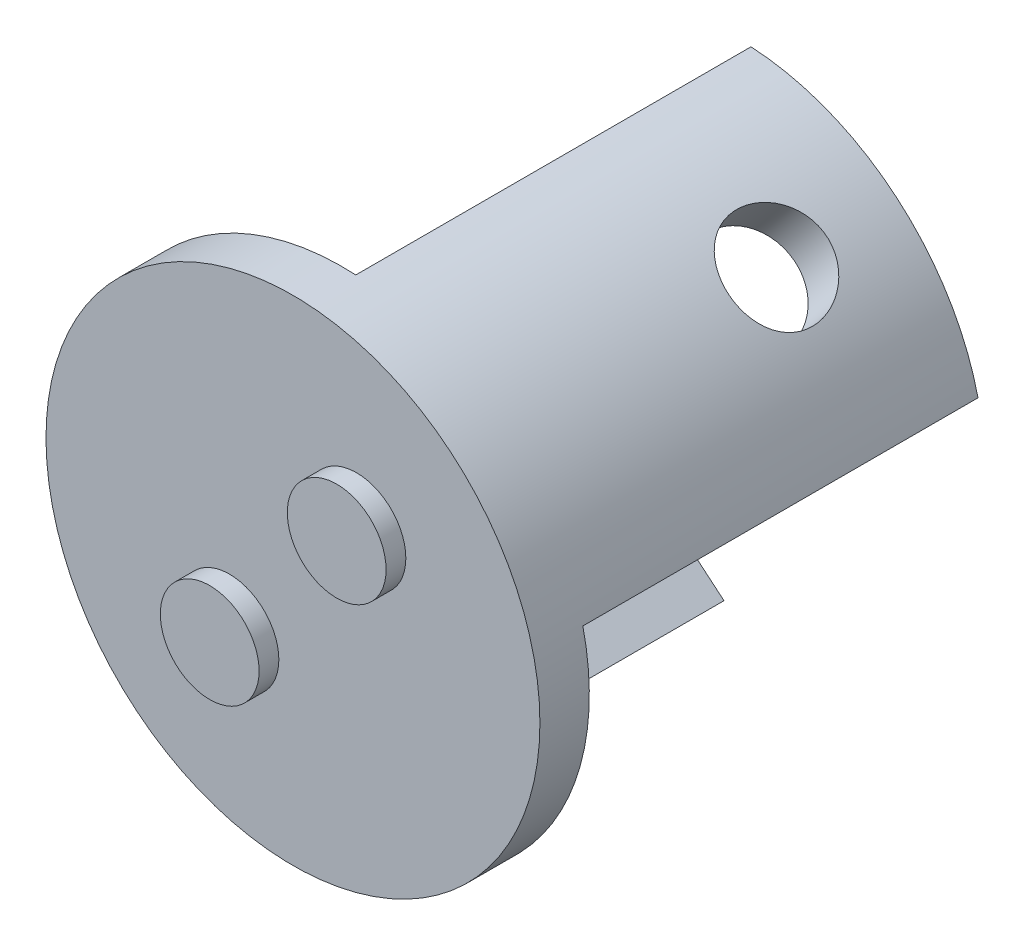
ISO-10303-21;
HEADER;
FILE_DESCRIPTION(('STEP AP214'),'2;1');
FILE_NAME('part.step','',(''),(''),'','','');
FILE_SCHEMA(('AUTOMOTIVE_DESIGN { 1 0 10303 214 1 1 1 1 }'));
ENDSEC;
DATA;
#1=APPLICATION_CONTEXT('core data for automotive mechanical design processes');
#2=APPLICATION_PROTOCOL_DEFINITION('international standard','automotive_design',2000,#1);
#3=PRODUCT_CONTEXT('',#1,'mechanical');
#4=PRODUCT('Part','Part','',(#3));
#5=PRODUCT_RELATED_PRODUCT_CATEGORY('part','',(#4));
#6=PRODUCT_DEFINITION_FORMATION('','',#4);
#7=PRODUCT_DEFINITION_CONTEXT('part definition',#1,'design');
#8=PRODUCT_DEFINITION('design','',#6,#7);
#9=PRODUCT_DEFINITION_SHAPE('','',#8);
#10=(LENGTH_UNIT() NAMED_UNIT(*) SI_UNIT(.MILLI.,.METRE.));
#11=(NAMED_UNIT(*) PLANE_ANGLE_UNIT() SI_UNIT($,.RADIAN.));
#12=(NAMED_UNIT(*) SI_UNIT($,.STERADIAN.) SOLID_ANGLE_UNIT());
#13=UNCERTAINTY_MEASURE_WITH_UNIT(LENGTH_MEASURE(1.E-05),#10,'distance_accuracy_value','');
#14=(GEOMETRIC_REPRESENTATION_CONTEXT(3) GLOBAL_UNCERTAINTY_ASSIGNED_CONTEXT((#13)) GLOBAL_UNIT_ASSIGNED_CONTEXT((#10,
#11,#12)) REPRESENTATION_CONTEXT('',''));
#15=CARTESIAN_POINT('',(0.,0.,0.));
#16=DIRECTION('',(0.,0.,1.));
#17=DIRECTION('',(1.,0.,0.));
#18=AXIS2_PLACEMENT_3D('',#15,#16,#17);
#19=CARTESIAN_POINT('',(0.,0.,0.));
#20=DIRECTION('',(0.,0.,1.));
#21=DIRECTION('',(1.,0.,0.));
#22=AXIS2_PLACEMENT_3D('',#19,#20,#21);
#23=PLANE('',#22);
#24=DIRECTION('',(0.766044443118976,-0.642787609686541,0.));
#25=VECTOR('',#24,1.);
#26=CARTESIAN_POINT('',(-12.8557521937308,-15.3208888623795,0.));
#27=LINE('',#26,#25);
#28=CARTESIAN_POINT('',(-24.3464188405155,-5.67907471708142,0.));
#29=VERTEX_POINT('',#28);
#30=CARTESIAN_POINT('',(-1.36508554694619,-24.9627030076776,0.));
#31=VERTEX_POINT('',#30);
#32=EDGE_CURVE('E51',#29,#31,#27,.T.);
#33=ORIENTED_EDGE('',*,*,#32,.F.);
#34=CARTESIAN_POINT('',(0.,0.,0.));
#35=DIRECTION('',(0.,0.,1.));
#36=DIRECTION('',(1.,0.,0.));
#37=AXIS2_PLACEMENT_3D('',#34,#35,#36);
#38=CIRCLE('',#37,25.);
#39=CARTESIAN_POINT('',(1.36508554694617,24.9627030076776,0.));
#40=VERTEX_POINT('',#39);
#41=EDGE_CURVE('E91',#40,#29,#38,.T.);
#42=ORIENTED_EDGE('',*,*,#41,.F.);
#43=DIRECTION('',(0.766044443118977,-0.642787609686541,0.));
#44=VECTOR('',#43,1.);
#45=CARTESIAN_POINT('',(12.8557521937308,15.3208888623795,0.));
#46=LINE('',#45,#44);
#47=CARTESIAN_POINT('',(24.3464188405155,5.67907471708142,0.));
#48=VERTEX_POINT('',#47);
#49=EDGE_CURVE('E92',#40,#48,#46,.T.);
#50=ORIENTED_EDGE('',*,*,#49,.T.);
#51=EDGE_CURVE('E58',#31,#48,#38,.T.);
#52=ORIENTED_EDGE('',*,*,#51,.F.);
#53=EDGE_LOOP('',(#33,#42,#50,#52));
#54=FACE_BOUND('',#53,.T.);
#55=ADVANCED_FACE('F34',(#54),#23,.F.);
#56=CARTESIAN_POINT('',(0.,0.,5.));
#57=DIRECTION('',(0.,0.,-1.));
#58=DIRECTION('',(-1.,0.,0.));
#59=AXIS2_PLACEMENT_3D('',#56,#57,#58);
#60=CYLINDRICAL_SURFACE('',#59,25.);
#61=CARTESIAN_POINT('',(19.5752387827479,15.5502420109271,-28.));
#62=CARTESIAN_POINT('',(19.5752399388023,15.5502390648004,-27.8610437715678));
#63=CARTESIAN_POINT('',(19.5715616552449,15.5548738945243,-27.722122240573));
#64=CARTESIAN_POINT('',(19.5568632156549,15.573350711597,-27.4452390892176));
#65=CARTESIAN_POINT('',(19.5458416724991,15.5871944384825,-27.307277655193));
#66=CARTESIAN_POINT('',(19.5164860999277,15.6239341696758,-27.0332858709187));
#67=CARTESIAN_POINT('',(19.4981483310895,15.6468348030395,-26.8972565450725));
#68=CARTESIAN_POINT('',(19.4542177659323,15.7014215351682,-26.6281110791934));
#69=CARTESIAN_POINT('',(19.42862229865,15.7331108682382,-26.4949960311311));
#70=CARTESIAN_POINT('',(19.3703089722856,15.8048493106287,-26.2328438594748));
#71=CARTESIAN_POINT('',(19.3376009952044,15.8448868179931,-26.1038013596023));
#72=CARTESIAN_POINT('',(19.2651413274371,15.9329086557767,-25.8504369587209));
#73=CARTESIAN_POINT('',(19.2253870382121,15.9808959174781,-25.7261168198334));
#74=CARTESIAN_POINT('',(19.138997951603,16.0842559512901,-25.4831366609698));
#75=CARTESIAN_POINT('',(19.0923662123409,16.1396254397801,-25.3644741561491));
#76=CARTESIAN_POINT('',(18.9923503983771,16.2572009585222,-25.1334921966877));
#77=CARTESIAN_POINT('',(18.938963801909,16.3194095408454,-25.0211751337375));
#78=CARTESIAN_POINT('',(18.8249388990272,16.4508155707056,-24.8023273728514));
#79=CARTESIAN_POINT('',(18.7642193379892,16.5200896942465,-24.6958850347564));
#80=CARTESIAN_POINT('',(18.6362660344895,16.6642996161466,-24.4909823888348));
#81=CARTESIAN_POINT('',(18.5690298860477,16.7392375033504,-24.3925250539721));
#82=CARTESIAN_POINT('',(18.4283438678951,16.8939950999759,-24.2043303455566));
#83=CARTESIAN_POINT('',(18.3548958409293,16.9738133597088,-24.114590402856));
#84=CARTESIAN_POINT('',(18.2020488088756,17.1376187104265,-23.9443844675538));
#85=CARTESIAN_POINT('',(18.1226476207836,17.2216073268164,-23.8639219046559));
#86=CARTESIAN_POINT('',(17.957574134156,17.3936725184606,-23.7122400706679));
#87=CARTESIAN_POINT('',(17.8718549037146,17.4817774288316,-23.6411038142726));
#88=CARTESIAN_POINT('',(17.6951710684105,17.6605996043244,-23.5093843802369));
#89=CARTESIAN_POINT('',(17.6042045129115,17.7513178345639,-23.4488051611513));
#90=CARTESIAN_POINT('',(17.3242105560941,18.0260844841214,-23.2837064735327));
#91=CARTESIAN_POINT('',(17.1278904293554,18.2129533419344,-23.1956431521848));
#92=CARTESIAN_POINT('',(16.7236881535392,18.5847454709976,-23.0674427049637));
#93=CARTESIAN_POINT('',(16.5159924250397,18.7696619361236,-23.0266894005891));
#94=CARTESIAN_POINT('',(16.0922117465078,19.1342299580353,-22.9922509518139));
#95=CARTESIAN_POINT('',(15.876127606868,19.3138820204794,-22.9985612718641));
#96=CARTESIAN_POINT('',(15.4451005611953,19.6602206612749,-23.0576294026319));
#97=CARTESIAN_POINT('',(15.2301852250241,19.8270554449764,-23.1097244842391));
#98=CARTESIAN_POINT('',(14.8049963337883,20.1465341954522,-23.2578255639107));
#99=CARTESIAN_POINT('',(14.5947229647983,20.299177594145,-23.3538333188906));
#100=CARTESIAN_POINT('',(14.1841859837537,20.5881603367852,-23.5876500921249));
#101=CARTESIAN_POINT('',(13.9839938034357,20.7243908714696,-23.7257187264038));
#102=CARTESIAN_POINT('',(13.6016201687298,20.9773345342774,-24.039545415307));
#103=CARTESIAN_POINT('',(13.4194407902992,21.0940454138496,-24.2153078067188));
#104=CARTESIAN_POINT('',(13.076346869086,21.308469265876,-24.603168102539));
#105=CARTESIAN_POINT('',(12.9158583139285,21.4058156520225,-24.8158459315038));
#106=CARTESIAN_POINT('',(12.6259471423197,21.5780903370969,-25.269582214398));
#107=CARTESIAN_POINT('',(12.4965251134485,21.6530182120163,-25.5106412049894));
#108=CARTESIAN_POINT('',(12.2736700447617,21.7801192782732,-26.0151041585344));
#109=CARTESIAN_POINT('',(12.1803146179855,21.8322434289843,-26.2785548380507));
#110=CARTESIAN_POINT('',(12.0340232052588,21.913223124176,-26.8198566187675));
#111=CARTESIAN_POINT('',(11.9810819514233,21.9420817012927,-27.0977058381111));
#112=CARTESIAN_POINT('',(11.9185521594503,21.9761091680608,-27.654824289987));
#113=CARTESIAN_POINT('',(11.9082373036806,21.9816749679074,-27.9339878716477));
#114=CARTESIAN_POINT('',(11.9294284223582,21.9701815655108,-28.4902411159245));
#115=CARTESIAN_POINT('',(11.9609320253527,21.9531236462197,-28.7673308952462));
#116=CARTESIAN_POINT('',(12.063842662026,21.8967361327185,-29.308843201799));
#117=CARTESIAN_POINT('',(12.1348641690568,21.8576216677851,-29.5733617164651));
#118=CARTESIAN_POINT('',(12.3135426773012,21.7574606175965,-30.0853163938573));
#119=CARTESIAN_POINT('',(12.4212026964356,21.6964122256166,-30.3327511473708));
#120=CARTESIAN_POINT('',(12.6705286990509,21.5517671240796,-30.8070655546213));
#121=CARTESIAN_POINT('',(12.8126196355626,21.4678868848336,-31.0336352497929));
#122=CARTESIAN_POINT('',(13.124690479875,21.2785275143757,-31.4565415417139));
#123=CARTESIAN_POINT('',(13.2946732579035,21.1730461600099,-31.6528750229515));
#124=CARTESIAN_POINT('',(13.6592882622623,20.9397068569448,-32.0128128652711));
#125=CARTESIAN_POINT('',(13.8542588258498,20.8115302616111,-32.1758685338953));
#126=CARTESIAN_POINT('',(14.2599374296815,20.5356820862245,-32.4607291468636));
#127=CARTESIAN_POINT('',(14.4706448085713,20.3880113252322,-32.5825358235458));
#128=CARTESIAN_POINT('',(14.899388774118,20.0768021503246,-32.7806453263062));
#129=CARTESIAN_POINT('',(15.1173761583466,19.9133600252156,-32.8572061926372));
#130=CARTESIAN_POINT('',(15.5548619161382,19.5735214871039,-32.9634526372471));
#131=CARTESIAN_POINT('',(15.7743601045148,19.3971266370252,-32.9931438612975));
#132=CARTESIAN_POINT('',(16.0974477734558,19.1282927056451,-33.0018003890947));
#133=CARTESIAN_POINT('',(16.2032564829247,19.0387410986983,-32.9988756420099));
#134=CARTESIAN_POINT('',(16.4128197901022,18.8583771110472,-32.9815385408312));
#135=CARTESIAN_POINT('',(16.5165751515464,18.767565221326,-32.9671305434389));
#136=CARTESIAN_POINT('',(16.7213640776187,18.5853382242976,-32.9269286368397));
#137=CARTESIAN_POINT('',(16.8223966866899,18.4939229188792,-32.9011307841561));
#138=CARTESIAN_POINT('',(17.0210309018278,18.3112724897373,-32.8383651655105));
#139=CARTESIAN_POINT('',(17.1186337205368,18.2200373133175,-32.8014013926633));
#140=CARTESIAN_POINT('',(17.3096726367366,18.0386405641335,-32.716666157964));
#141=CARTESIAN_POINT('',(17.4031164444738,17.9484772530634,-32.6689157852204));
#142=CARTESIAN_POINT('',(17.5854881404117,17.7698310663931,-32.562942077317));
#143=CARTESIAN_POINT('',(17.6744176148304,17.6813476074747,-32.5047224538994));
#144=CARTESIAN_POINT('',(17.8473757274636,17.5067497803388,-32.3781933829961));
#145=CARTESIAN_POINT('',(17.9314023309262,17.4206364034576,-32.3098797873512));
#146=CARTESIAN_POINT('',(18.0940892205724,17.2515997296971,-32.1636856073457));
#147=CARTESIAN_POINT('',(18.1727513377297,17.1686753486264,-32.0858083128838));
#148=CARTESIAN_POINT('',(18.3256504895279,17.005388902902,-31.9196372325023));
#149=CARTESIAN_POINT('',(18.399793066899,16.9250917134978,-31.831192745672));
#150=CARTESIAN_POINT('',(18.5418761570465,16.769315462601,-31.6455885973766));
#151=CARTESIAN_POINT('',(18.6098188393822,16.6938347184683,-31.5484320083593));
#152=CARTESIAN_POINT('',(18.7393052222968,16.5483513082206,-31.345972526609));
#153=CARTESIAN_POINT('',(18.8008450713632,16.4783519455255,-31.2406647963557));
#154=CARTESIAN_POINT('',(18.9172291528241,16.3446106998393,-31.0227010381552));
#155=CARTESIAN_POINT('',(18.9720758357533,16.2808665283516,-30.9100477229278));
#156=CARTESIAN_POINT('',(19.0754790244173,16.1595953982595,-30.6768148430827));
#157=CARTESIAN_POINT('',(19.1239583880762,16.1021458774797,-30.5561607708029));
#158=CARTESIAN_POINT('',(19.2137066704173,15.9949480386978,-30.3089555311573));
#159=CARTESIAN_POINT('',(19.2549782371345,15.9451968931984,-30.1824065512268));
#160=CARTESIAN_POINT('',(19.3301633635701,15.8539673670231,-29.9243288844637));
#161=CARTESIAN_POINT('',(19.3640814125222,15.8124839402607,-29.792803293728));
#162=CARTESIAN_POINT('',(19.4244613870496,15.7382521445056,-29.5256860019017));
#163=CARTESIAN_POINT('',(19.4509247552149,15.7055020855439,-29.3900950931365));
#164=CARTESIAN_POINT('',(19.5073909673155,15.6353655981149,-29.0487823116088));
#165=CARTESIAN_POINT('',(19.5328206461949,15.6035138122674,-28.841122048542));
#166=CARTESIAN_POINT('',(19.5667433838373,15.5609546210052,-28.4222810828269));
#167=CARTESIAN_POINT('',(19.575237026485,15.5502464866447,-28.2111005017978));
#168=CARTESIAN_POINT('',(19.5752387827479,15.5502420109271,-28.));
#169=B_SPLINE_CURVE_WITH_KNOTS('',3,(#61,#62,#63,#64,#65,#66,#67,#68,#69,#70,#71,#72,#73,#74,
#75,#76,#77,#78,#79,#80,#81,#82,#83,#84,#85,#86,#87,#88,#89,#90,#91,#92,#93,#94,#95,#96,#97,#98,
#99,#100,#101,#102,#103,#104,#105,#106,#107,#108,#109,#110,#111,#112,#113,#114,#115,#116,#117,
#118,#119,#120,#121,#122,#123,#124,#125,#126,#127,#128,#129,#130,#131,#132,#133,#134,#135,#136,
#137,#138,#139,#140,#141,#142,#143,#144,#145,#146,#147,#148,#149,#150,#151,#152,#153,#154,#155,
#156,#157,#158,#159,#160,#161,#162,#163,#164,#165,#166,#167,#168),.UNSPECIFIED.,.T.,.F.,(4,2,2,
2,2,2,2,2,2,2,2,2,2,2,2,2,2,2,2,2,2,2,2,2,2,2,2,2,2,2,2,2,2,2,2,2,2,2,2,2,2,2,2,2,2,2,2,2,2,2,2,
2,2,4),(0.,0.416683123532559,0.833444979779735,1.25042012213458,1.66754891843381,
2.08410182437339,2.50080866752238,2.91733077366025,3.33400883985332,3.75582155231457,
4.17779059926177,4.59963490581337,5.02163466502476,5.44716701587087,5.87285858614629,
6.72323197660176,7.56240100842779,8.40148917008619,9.22862804595065,10.0558000179613,
10.8881847753889,11.7206653527771,12.5676559023979,13.4146624704098,14.2634817229126,
15.112190315075,15.9463764545252,16.780515290738,17.6066556534829,18.4328640820369,
19.269841553043,20.1069052078274,20.9568186509895,21.8066963958222,22.6516792432494,
23.4965602988983,23.9121012971265,24.3274847156826,24.7430120641575,25.158390988859,
25.5729647204247,25.9873917587991,26.4019895837877,26.8164451851411,27.2377409358741,
27.6588886906077,28.0802883323103,28.5015332232677,28.9274855291216,29.3532810158644,
29.7788158230356,30.2042682263315,30.8373096537297,31.4703292560956),.UNSPECIFIED.);
#170=CARTESIAN_POINT('',(19.5752387827479,15.5502420109271,-28.));
#171=VERTEX_POINT('',#170);
#172=EDGE_CURVE('E135',#171,#171,#169,.T.);
#173=ORIENTED_EDGE('',*,*,#172,.T.);
#174=EDGE_LOOP('',(#173));
#175=FACE_BOUND('',#174,.T.);
#176=CARTESIAN_POINT('',(-11.9147943515581,-21.9781181077926,-28.));
#177=CARTESIAN_POINT('',(-11.9147912494429,-21.9781187346944,-28.1389562284322));
#178=CARTESIAN_POINT('',(-11.9199943929256,-21.9753011622646,-28.277877759427));
#179=CARTESIAN_POINT('',(-11.9407428628791,-21.964034490613,-28.5547609107824));
#180=CARTESIAN_POINT('',(-11.9562901433306,-21.9555843274088,-28.692722344807));
#181=CARTESIAN_POINT('',(-11.9975692571347,-21.933054519316,-28.9667141290813));
#182=CARTESIAN_POINT('',(-12.0233062985615,-21.9189719956422,-29.1027434549275));
#183=CARTESIAN_POINT('',(-12.0846921981569,-21.8851877210401,-29.3718889208066));
#184=CARTESIAN_POINT('',(-12.120344705302,-21.8654839013576,-29.5050039688689));
#185=CARTESIAN_POINT('',(-12.2011192824141,-21.8205137352398,-29.7671561405252));
#186=CARTESIAN_POINT('',(-12.2462282106932,-21.7952551060171,-29.8961986403977));
#187=CARTESIAN_POINT('',(-12.345495288239,-21.7391810951452,-30.1495630412791));
#188=CARTESIAN_POINT('',(-12.3996567754867,-21.7083636634466,-30.2738831801666));
#189=CARTESIAN_POINT('',(-12.5164478455964,-21.6412353026934,-30.5168633390302));
#190=CARTESIAN_POINT('',(-12.5790736636859,-21.6049268151063,-30.6355258438509));
#191=CARTESIAN_POINT('',(-12.7122305099402,-21.5268472406587,-30.8665078033123));
#192=CARTESIAN_POINT('',(-12.7827644893046,-21.4850741135056,-30.9788248662625));
#193=CARTESIAN_POINT('',(-12.9319743828975,-21.3955999227309,-31.1976726271486));
#194=CARTESIAN_POINT('',(-13.0107399179667,-21.3478321535734,-31.3041149652436));
#195=CARTESIAN_POINT('',(-13.1749778250944,-21.2468645384029,-31.5090176111652));
#196=CARTESIAN_POINT('',(-13.2604526720573,-21.1936626856859,-31.6074749460279));
#197=CARTESIAN_POINT('',(-13.437289023727,-21.0819873789029,-31.7956696544435));
#198=CARTESIAN_POINT('',(-13.5286487807798,-21.0235154878507,-31.885409597144));
#199=CARTESIAN_POINT('',(-13.7165071687294,-20.9014350463035,-32.0556155324462));
#200=CARTESIAN_POINT('',(-13.8130076809317,-20.837824610853,-32.1360780953441));
#201=CARTESIAN_POINT('',(-14.0111235258205,-20.7051377683743,-32.2877599293321));
#202=CARTESIAN_POINT('',(-14.1127749127894,-20.6360200627828,-32.3588961857274));
#203=CARTESIAN_POINT('',(-14.319561203649,-20.4930725968442,-32.4906156197631));
#204=CARTESIAN_POINT('',(-14.4246973967194,-20.4192410830862,-32.5511948388487));
#205=CARTESIAN_POINT('',(-14.743910163832,-20.1912135915951,-32.7162935264673));
#206=CARTESIAN_POINT('',(-14.9620306960503,-20.0303254453325,-32.8043568478153));
#207=CARTESIAN_POINT('',(-15.3983634558649,-19.6968249360062,-32.9325572950363));
#208=CARTESIAN_POINT('',(-15.6165366091437,-19.5243949795022,-32.9733105994109));
#209=CARTESIAN_POINT('',(-16.0491547661802,-19.1703590543477,-33.0077490481861));
#210=CARTESIAN_POINT('',(-16.263600127191,-18.988753971585,-33.0014387281359));
#211=CARTESIAN_POINT('',(-16.6795241668204,-18.6244162690784,-32.9423705973681));
#212=CARTESIAN_POINT('',(-16.8811440117605,-18.441736535937,-32.8902755157609));
#213=CARTESIAN_POINT('',(-17.2696024382791,-18.0784841221767,-32.7421744360893));
#214=CARTESIAN_POINT('',(-17.4564404280948,-17.8979115261593,-32.6461666811094));
#215=CARTESIAN_POINT('',(-17.8123218721569,-17.543792850965,-32.4123499078751));
#216=CARTESIAN_POINT('',(-17.9812457662065,-17.3702982237859,-32.2742812735962));
#217=CARTESIAN_POINT('',(-18.2967451312695,-17.037656909879,-31.960454584693));
#218=CARTESIAN_POINT('',(-18.4433180274061,-16.8785118771133,-31.7846921932812));
#219=CARTESIAN_POINT('',(-18.7140619334996,-16.5778646346439,-31.396831897461));
#220=CARTESIAN_POINT('',(-18.8377979544439,-16.4367182838119,-31.1841540684963));
#221=CARTESIAN_POINT('',(-19.0577979465881,-16.1811266994479,-30.730417785602));
#222=CARTESIAN_POINT('',(-19.1540613981889,-16.0666819709413,-30.4893587950106));
#223=CARTESIAN_POINT('',(-19.3179298902161,-15.8692834400355,-29.9848958414656));
#224=CARTESIAN_POINT('',(-19.3854731576906,-15.7863975557439,-29.7214451619493));
#225=CARTESIAN_POINT('',(-19.4906258265803,-15.6563906147896,-29.1801433812325));
#226=CARTESIAN_POINT('',(-19.5282391293176,-15.6092648968846,-28.9022941618889));
#227=CARTESIAN_POINT('',(-19.5726078268322,-15.5535938805503,-28.345175710013));
#228=CARTESIAN_POINT('',(-19.5798802255802,-15.5444022216177,-28.0660121283523));
#229=CARTESIAN_POINT('',(-19.5648816346504,-15.563275591205,-27.5097588840755));
#230=CARTESIAN_POINT('',(-19.5426123202324,-15.5913385070821,-27.2326691047538));
#231=CARTESIAN_POINT('',(-19.4692112152424,-15.6828941109828,-26.691156798201));
#232=CARTESIAN_POINT('',(-19.41835823165,-15.7460444861812,-26.4266382835349));
#233=CARTESIAN_POINT('',(-19.2886916555296,-15.9046156825585,-25.9146836061427));
#234=CARTESIAN_POINT('',(-19.2098757596685,-16.0000391620747,-25.6672488526292));
#235=CARTESIAN_POINT('',(-19.0241331362405,-16.2204599841874,-25.1929344453787));
#236=CARTESIAN_POINT('',(-18.9168533941183,-16.3458265894096,-24.9663647502071));
#237=CARTESIAN_POINT('',(-18.676180284568,-16.6202744667734,-24.5434584582861));
#238=CARTESIAN_POINT('',(-18.542784229351,-16.7693581794909,-24.3471249770485));
#239=CARTESIAN_POINT('',(-18.2496751435531,-17.0879149178927,-23.9871871347289));
#240=CARTESIAN_POINT('',(-18.089589555648,-17.2576658083236,-23.8241314661047));
#241=CARTESIAN_POINT('',(-17.7474867835992,-17.6092807096396,-23.5392708531364));
#242=CARTESIAN_POINT('',(-17.5654705209156,-17.7911442114461,-23.4174641764542));
#243=CARTESIAN_POINT('',(-17.1845387043552,-18.1593336866778,-23.2193546736938));
#244=CARTESIAN_POINT('',(-16.9857265203534,-18.3456279255458,-23.1427938073628));
#245=CARTESIAN_POINT('',(-16.5750822886529,-18.7174549488073,-23.0365473627529));
#246=CARTESIAN_POINT('',(-16.3632518122912,-18.9029878222267,-23.0068561387025));
#247=CARTESIAN_POINT('',(-16.0423984874571,-19.1744845412232,-22.9981996109053));
#248=CARTESIAN_POINT('',(-15.9358338810606,-19.2631353052909,-23.0011243579901));
#249=CARTESIAN_POINT('',(-15.7218197412604,-19.4381949971738,-23.0184614591688));
#250=CARTESIAN_POINT('',(-15.6143705587593,-19.5246047623802,-23.0328694565611));
#251=CARTESIAN_POINT('',(-15.3993507754588,-19.6946390985515,-23.0730713631604));
#252=CARTESIAN_POINT('',(-15.2917801454886,-19.7782626940751,-23.0988692158439));
#253=CARTESIAN_POINT('',(-15.0774121172976,-19.9421622949858,-23.1616348344895));
#254=CARTESIAN_POINT('',(-14.970614456608,-20.0224394854419,-23.1985986073367));
#255=CARTESIAN_POINT('',(-14.7587999719788,-20.179076876312,-23.283333842036));
#256=CARTESIAN_POINT('',(-14.6537800972719,-20.2554443679828,-23.3310842147796));
#257=CARTESIAN_POINT('',(-14.4461794349353,-20.40402384331,-23.4370579226831));
#258=CARTESIAN_POINT('',(-14.3435977974054,-20.476237287794,-23.4952775461006));
#259=CARTESIAN_POINT('',(-14.1416186425114,-20.6162491835548,-23.621806617004));
#260=CARTESIAN_POINT('',(-14.0422224547539,-20.6840458031358,-23.6901202126488));
#261=CARTESIAN_POINT('',(-13.8475035459739,-20.8149082030155,-23.8363143926543));
#262=CARTESIAN_POINT('',(-13.7521794392859,-20.8779755982033,-23.9141916871162));
#263=CARTESIAN_POINT('',(-13.5648230224981,-21.0001974745853,-24.0803627674977));
#264=CARTESIAN_POINT('',(-13.4728710043798,-21.059270198997,-24.168807254328));
#265=CARTESIAN_POINT('',(-13.29478887508,-21.1721444656541,-24.3544114026234));
#266=CARTESIAN_POINT('',(-13.2086567300816,-21.2259478523112,-24.4515679916407));
#267=CARTESIAN_POINT('',(-13.0428984653092,-21.3282041170447,-24.654027473391));
#268=CARTESIAN_POINT('',(-12.9632762675769,-21.3766537757546,-24.7593352036443));
#269=CARTESIAN_POINT('',(-12.8113569682725,-21.4680457979122,-24.9772989618448));
#270=CARTESIAN_POINT('',(-12.7390571874404,-21.5109901772721,-25.0899522770722));
#271=CARTESIAN_POINT('',(-12.6016726630326,-21.5917639284105,-25.3231851569173));
#272=CARTESIAN_POINT('',(-12.536677576408,-21.6295307770117,-25.4438392291971));
#273=CARTESIAN_POINT('',(-12.4155236879922,-21.6993008719264,-25.6910444688427));
#274=CARTESIAN_POINT('',(-12.3593616418333,-21.7313062350557,-25.8175934487732));
#275=CARTESIAN_POINT('',(-12.256462336959,-21.7895072895109,-26.0756711155363));
#276=CARTESIAN_POINT('',(-12.2097193292713,-21.8157065256252,-26.207196706272));
#277=CARTESIAN_POINT('',(-12.1261304087474,-21.8622789766087,-26.4743139980983));
#278=CARTESIAN_POINT('',(-12.0892825811135,-21.8826533186915,-26.6099049068635));
#279=CARTESIAN_POINT('',(-12.0104063696933,-21.9260826089214,-26.9512176883912));
#280=CARTESIAN_POINT('',(-11.9746226666474,-21.9455949492706,-27.158877951458));
#281=CARTESIAN_POINT('',(-11.9268194235573,-21.9716119982986,-27.5777189171731));
#282=CARTESIAN_POINT('',(-11.9147990642513,-21.9781171554115,-27.7888994982022));
#283=CARTESIAN_POINT('',(-11.9147943515581,-21.9781181077926,-28.));
#284=B_SPLINE_CURVE_WITH_KNOTS('',3,(#176,#177,#178,#179,#180,#181,#182,#183,#184,#185,#186,
#187,#188,#189,#190,#191,#192,#193,#194,#195,#196,#197,#198,#199,#200,#201,#202,#203,#204,#205,
#206,#207,#208,#209,#210,#211,#212,#213,#214,#215,#216,#217,#218,#219,#220,#221,#222,#223,#224,
#225,#226,#227,#228,#229,#230,#231,#232,#233,#234,#235,#236,#237,#238,#239,#240,#241,#242,#243,
#244,#245,#246,#247,#248,#249,#250,#251,#252,#253,#254,#255,#256,#257,#258,#259,#260,#261,#262,
#263,#264,#265,#266,#267,#268,#269,#270,#271,#272,#273,#274,#275,#276,#277,#278,#279,#280,#281,
#282,#283),.UNSPECIFIED.,.T.,.F.,(4,2,2,2,2,2,2,2,2,2,2,2,2,2,2,2,2,2,2,2,2,2,2,2,2,2,2,2,2,2,2,
2,2,2,2,2,2,2,2,2,2,2,2,2,2,2,2,2,2,2,2,2,2,4),(0.,0.416683123532559,0.833444979779735,
1.25042012213458,1.66754891843381,2.08410182437339,2.50080866752237,2.91733077366025,
3.33400883985332,3.75582155231456,4.17779059926177,4.59963490581336,5.02163466502476,
5.44716701587086,5.87285858614628,6.72323197660176,7.56240100842779,8.40148917008618,
9.22862804595064,10.0558000179613,10.8881847753889,11.7206653527771,12.5676559023979,
13.4146624704098,14.2634817229126,15.112190315075,15.9463764545252,16.780515290738,
17.6066556534829,18.4328640820368,19.269841553043,20.1069052078274,20.9568186509895,
21.8066963958222,22.6516792432494,23.4965602988983,23.9121012971265,24.3274847156826,
24.7430120641575,25.158390988859,25.5729647204247,25.9873917587991,26.4019895837877,
26.8164451851411,27.2377409358741,27.6588886906077,28.0802883323103,28.5015332232677,
28.9274855291216,29.3532810158644,29.7788158230356,30.2042682263315,30.8373096537297,
31.4703292560956),.UNSPECIFIED.);
#285=CARTESIAN_POINT('',(-11.9147943515581,-21.9781181077926,-28.));
#286=VERTEX_POINT('',#285);
#287=EDGE_CURVE('E138',#286,#286,#284,.T.);
#288=ORIENTED_EDGE('',*,*,#287,.T.);
#289=EDGE_LOOP('',(#288));
#290=FACE_BOUND('',#289,.T.);
#291=CARTESIAN_POINT('',(0.,0.,5.));
#292=DIRECTION('',(0.,0.,1.));
#293=DIRECTION('',(1.,0.,0.));
#294=AXIS2_PLACEMENT_3D('',#291,#292,#293);
#295=CIRCLE('',#294,25.);
#296=CARTESIAN_POINT('',(25.,0.,5.));
#297=VERTEX_POINT('',#296);
#298=EDGE_CURVE('E44',#297,#297,#295,.T.);
#299=ORIENTED_EDGE('',*,*,#298,.F.);
#300=EDGE_LOOP('',(#299));
#301=FACE_BOUND('',#300,.T.);
#302=ORIENTED_EDGE('',*,*,#41,.T.);
#303=DIRECTION('',(0.,0.,1.));
#304=VECTOR('',#303,1.);
#305=CARTESIAN_POINT('',(-24.3464188405155,-5.67907471708142,-40.));
#306=LINE('',#305,#304);
#307=CARTESIAN_POINT('',(-24.3464188405155,-5.67907471708142,-40.));
#308=VERTEX_POINT('',#307);
#309=EDGE_CURVE('E83',#308,#29,#306,.T.);
#310=ORIENTED_EDGE('',*,*,#309,.F.);
#311=CARTESIAN_POINT('',(0.,0.,-40.));
#312=DIRECTION('',(0.,0.,-1.));
#313=DIRECTION('',(-1.,0.,0.));
#314=AXIS2_PLACEMENT_3D('',#311,#312,#313);
#315=CIRCLE('',#314,25.);
#316=CARTESIAN_POINT('',(-1.36508554694619,-24.9627030076776,-40.));
#317=VERTEX_POINT('',#316);
#318=EDGE_CURVE('E87',#317,#308,#315,.T.);
#319=ORIENTED_EDGE('',*,*,#318,.F.);
#320=DIRECTION('',(0.,0.,1.));
#321=VECTOR('',#320,1.);
#322=CARTESIAN_POINT('',(-1.36508554694619,-24.9627030076776,-40.));
#323=LINE('',#322,#321);
#324=EDGE_CURVE('E84',#317,#31,#323,.T.);
#325=ORIENTED_EDGE('',*,*,#324,.T.);
#326=ORIENTED_EDGE('',*,*,#51,.T.);
#327=DIRECTION('',(0.,0.,1.));
#328=VECTOR('',#327,1.);
#329=CARTESIAN_POINT('',(24.3464188405155,5.67907471708142,-40.));
#330=LINE('',#329,#328);
#331=CARTESIAN_POINT('',(24.3464188405155,5.67907471708142,-40.));
#332=VERTEX_POINT('',#331);
#333=EDGE_CURVE('E103',#332,#48,#330,.T.);
#334=ORIENTED_EDGE('',*,*,#333,.F.);
#335=CARTESIAN_POINT('',(0.,0.,-40.));
#336=DIRECTION('',(0.,0.,-1.));
#337=DIRECTION('',(-1.,0.,0.));
#338=AXIS2_PLACEMENT_3D('',#335,#336,#337);
#339=CIRCLE('',#338,25.);
#340=CARTESIAN_POINT('',(1.36508554694617,24.9627030076776,-40.));
#341=VERTEX_POINT('',#340);
#342=EDGE_CURVE('E102',#341,#332,#339,.T.);
#343=ORIENTED_EDGE('',*,*,#342,.F.);
#344=DIRECTION('',(0.,0.,1.));
#345=VECTOR('',#344,1.);
#346=CARTESIAN_POINT('',(1.36508554694617,24.9627030076776,-40.));
#347=LINE('',#346,#345);
#348=EDGE_CURVE('E106',#341,#40,#347,.T.);
#349=ORIENTED_EDGE('',*,*,#348,.T.);
#350=EDGE_LOOP('',(#302,#310,#319,#325,#326,#334,#343,#349));
#351=FACE_BOUND('',#350,.T.);
#352=ADVANCED_FACE('F36',(#175,#290,#301,#351),#60,.T.);
#353=CARTESIAN_POINT('',(0.,0.,5.));
#354=DIRECTION('',(0.,0.,1.));
#355=DIRECTION('',(1.,0.,0.));
#356=AXIS2_PLACEMENT_3D('',#353,#354,#355);
#357=PLANE('',#356);
#358=CARTESIAN_POINT('',(6.4278760968654,7.66044443118977,5.));
#359=DIRECTION('',(0.,0.,1.));
#360=DIRECTION('',(1.,0.,0.));
#361=AXIS2_PLACEMENT_3D('',#358,#359,#360);
#362=CIRCLE('',#361,5.);
#363=CARTESIAN_POINT('',(11.4278760968654,7.66044443118977,5.));
#364=VERTEX_POINT('',#363);
#365=EDGE_CURVE('E11',#364,#364,#362,.T.);
#366=ORIENTED_EDGE('',*,*,#365,.F.);
#367=EDGE_LOOP('',(#366));
#368=FACE_BOUND('',#367,.T.);
#369=CARTESIAN_POINT('',(-6.42787609686541,-7.66044443118976,5.));
#370=DIRECTION('',(0.,0.,1.));
#371=DIRECTION('',(1.,0.,0.));
#372=AXIS2_PLACEMENT_3D('',#369,#370,#371);
#373=CIRCLE('',#372,5.);
#374=CARTESIAN_POINT('',(-1.42787609686541,-7.66044443118976,5.));
#375=VERTEX_POINT('',#374);
#376=EDGE_CURVE('E111',#375,#375,#373,.T.);
#377=ORIENTED_EDGE('',*,*,#376,.F.);
#378=EDGE_LOOP('',(#377));
#379=FACE_BOUND('',#378,.T.);
#380=ORIENTED_EDGE('',*,*,#298,.T.);
#381=EDGE_LOOP('',(#380));
#382=FACE_BOUND('',#381,.T.);
#383=ADVANCED_FACE('F121',(#368,#379,#382),#357,.T.);
#384=CARTESIAN_POINT('',(-6.42787609686541,-7.66044443118976,7.));
#385=DIRECTION('',(0.,0.,-1.));
#386=DIRECTION('',(-1.,0.,0.));
#387=AXIS2_PLACEMENT_3D('',#384,#385,#386);
#388=CYLINDRICAL_SURFACE('',#387,5.);
#389=CARTESIAN_POINT('',(-6.42787609686541,-7.66044443118976,7.));
#390=DIRECTION('',(0.,0.,1.));
#391=DIRECTION('',(1.,0.,0.));
#392=AXIS2_PLACEMENT_3D('',#389,#390,#391);
#393=CIRCLE('',#392,5.);
#394=CARTESIAN_POINT('',(-1.42787609686541,-7.66044443118976,7.));
#395=VERTEX_POINT('',#394);
#396=EDGE_CURVE('E112',#395,#395,#393,.T.);
#397=ORIENTED_EDGE('',*,*,#396,.F.);
#398=EDGE_LOOP('',(#397));
#399=FACE_BOUND('',#398,.T.);
#400=ORIENTED_EDGE('',*,*,#376,.T.);
#401=EDGE_LOOP('',(#400));
#402=FACE_BOUND('',#401,.T.);
#403=ADVANCED_FACE('F129',(#399,#402),#388,.T.);
#404=CARTESIAN_POINT('',(0.,0.,7.));
#405=DIRECTION('',(0.,0.,1.));
#406=DIRECTION('',(1.,0.,0.));
#407=AXIS2_PLACEMENT_3D('',#404,#405,#406);
#408=PLANE('',#407);
#409=ORIENTED_EDGE('',*,*,#396,.T.);
#410=EDGE_LOOP('',(#409));
#411=FACE_BOUND('',#410,.T.);
#412=ADVANCED_FACE('F179',(#411),#408,.T.);
#413=CARTESIAN_POINT('',(6.4278760968654,7.66044443118977,7.));
#414=DIRECTION('',(0.,0.,-1.));
#415=DIRECTION('',(-1.,0.,0.));
#416=AXIS2_PLACEMENT_3D('',#413,#414,#415);
#417=CYLINDRICAL_SURFACE('',#416,5.);
#418=CARTESIAN_POINT('',(6.4278760968654,7.66044443118977,7.));
#419=DIRECTION('',(0.,0.,1.));
#420=DIRECTION('',(1.,0.,0.));
#421=AXIS2_PLACEMENT_3D('',#418,#419,#420);
#422=CIRCLE('',#421,5.);
#423=CARTESIAN_POINT('',(11.4278760968654,7.66044443118977,7.));
#424=VERTEX_POINT('',#423);
#425=EDGE_CURVE('E108',#424,#424,#422,.F.);
#426=ORIENTED_EDGE('',*,*,#425,.T.);
#427=EDGE_LOOP('',(#426));
#428=FACE_BOUND('',#427,.T.);
#429=ORIENTED_EDGE('',*,*,#365,.T.);
#430=EDGE_LOOP('',(#429));
#431=FACE_BOUND('',#430,.T.);
#432=ADVANCED_FACE('F175',(#428,#431),#417,.T.);
#433=CARTESIAN_POINT('',(0.,0.,7.));
#434=DIRECTION('',(0.,0.,1.));
#435=DIRECTION('',(1.,0.,0.));
#436=AXIS2_PLACEMENT_3D('',#433,#434,#435);
#437=PLANE('',#436);
#438=ORIENTED_EDGE('',*,*,#425,.F.);
#439=EDGE_LOOP('',(#438));
#440=FACE_BOUND('',#439,.T.);
#441=ADVANCED_FACE('F171',(#440),#437,.T.);
#442=CARTESIAN_POINT('',(12.8557521937308,15.3208888623795,-40.));
#443=DIRECTION('',(-0.642787609686541,-0.766044443118977,0.));
#444=DIRECTION('',(0.766044443118977,-0.642787609686541,0.));
#445=AXIS2_PLACEMENT_3D('',#442,#443,#444);
#446=PLANE('',#445);
#447=CARTESIAN_POINT('',(12.8557521937308,15.3208888623795,-28.));
#448=DIRECTION('',(-0.642787609686541,-0.766044443118977,0.));
#449=DIRECTION('',(0.766044443118977,-0.642787609686541,0.));
#450=AXIS2_PLACEMENT_3D('',#447,#448,#449);
#451=CIRCLE('',#450,5.);
#452=CARTESIAN_POINT('',(16.6859744093257,12.1069508139468,-28.));
#453=VERTEX_POINT('',#452);
#454=EDGE_CURVE('E140',#453,#453,#451,.T.);
#455=ORIENTED_EDGE('',*,*,#454,.F.);
#456=EDGE_LOOP('',(#455));
#457=FACE_BOUND('',#456,.T.);
#458=ORIENTED_EDGE('',*,*,#49,.F.);
#459=ORIENTED_EDGE('',*,*,#348,.F.);
#460=DIRECTION('',(0.766044443118977,-0.642787609686541,0.));
#461=VECTOR('',#460,1.);
#462=CARTESIAN_POINT('',(12.8557521937308,15.3208888623795,-40.));
#463=LINE('',#462,#461);
#464=EDGE_CURVE('E95',#341,#332,#463,.T.);
#465=ORIENTED_EDGE('',*,*,#464,.T.);
#466=ORIENTED_EDGE('',*,*,#333,.T.);
#467=EDGE_LOOP('',(#458,#459,#465,#466));
#468=FACE_BOUND('',#467,.T.);
#469=ADVANCED_FACE('F167',(#457,#468),#446,.T.);
#470=CARTESIAN_POINT('',(0.,0.,-40.));
#471=DIRECTION('',(0.,0.,-1.));
#472=DIRECTION('',(-1.,0.,0.));
#473=AXIS2_PLACEMENT_3D('',#470,#471,#472);
#474=PLANE('',#473);
#475=ORIENTED_EDGE('',*,*,#464,.F.);
#476=ORIENTED_EDGE('',*,*,#342,.T.);
#477=EDGE_LOOP('',(#475,#476));
#478=FACE_BOUND('',#477,.T.);
#479=ADVANCED_FACE('F163',(#478),#474,.T.);
#480=CARTESIAN_POINT('',(-12.8557521937308,-15.3208888623795,-40.));
#481=DIRECTION('',(-0.642787609686541,-0.766044443118976,0.));
#482=DIRECTION('',(0.766044443118976,-0.642787609686541,0.));
#483=AXIS2_PLACEMENT_3D('',#480,#481,#482);
#484=PLANE('',#483);
#485=CARTESIAN_POINT('',(-12.8557521937308,-15.3208888623795,-28.));
#486=DIRECTION('',(-0.642787609686541,-0.766044443118976,0.));
#487=DIRECTION('',(0.766044443118976,-0.642787609686541,0.));
#488=AXIS2_PLACEMENT_3D('',#485,#486,#487);
#489=CIRCLE('',#488,5.);
#490=CARTESIAN_POINT('',(-9.02552997813594,-18.5348269108122,-28.));
#491=VERTEX_POINT('',#490);
#492=EDGE_CURVE('E39',#491,#491,#489,.T.);
#493=ORIENTED_EDGE('',*,*,#492,.T.);
#494=EDGE_LOOP('',(#493));
#495=FACE_BOUND('',#494,.T.);
#496=ORIENTED_EDGE('',*,*,#32,.T.);
#497=ORIENTED_EDGE('',*,*,#324,.F.);
#498=DIRECTION('',(0.766044443118976,-0.642787609686541,0.));
#499=VECTOR('',#498,1.);
#500=CARTESIAN_POINT('',(-12.8557521937308,-15.3208888623795,-40.));
#501=LINE('',#500,#499);
#502=EDGE_CURVE('E79',#308,#317,#501,.T.);
#503=ORIENTED_EDGE('',*,*,#502,.F.);
#504=ORIENTED_EDGE('',*,*,#309,.T.);
#505=EDGE_LOOP('',(#496,#497,#503,#504));
#506=FACE_BOUND('',#505,.T.);
#507=ADVANCED_FACE('F81',(#495,#506),#484,.F.);
#508=CARTESIAN_POINT('',(0.,0.,-40.));
#509=DIRECTION('',(0.,0.,-1.));
#510=DIRECTION('',(-1.,0.,0.));
#511=AXIS2_PLACEMENT_3D('',#508,#509,#510);
#512=PLANE('',#511);
#513=ORIENTED_EDGE('',*,*,#318,.T.);
#514=ORIENTED_EDGE('',*,*,#502,.T.);
#515=EDGE_LOOP('',(#513,#514));
#516=FACE_BOUND('',#515,.T.);
#517=ADVANCED_FACE('F89',(#516),#512,.T.);
#518=CARTESIAN_POINT('',(22.639494691816,26.9806991334892,-28.));
#519=DIRECTION('',(-0.642787609686541,-0.766044443118977,0.));
#520=DIRECTION('',(0.766044443118977,-0.642787609686541,0.));
#521=AXIS2_PLACEMENT_3D('',#518,#519,#520);
#522=CYLINDRICAL_SURFACE('',#521,5.);
#523=ORIENTED_EDGE('',*,*,#492,.F.);
#524=EDGE_LOOP('',(#523));
#525=FACE_BOUND('',#524,.T.);
#526=ORIENTED_EDGE('',*,*,#287,.F.);
#527=EDGE_LOOP('',(#526));
#528=FACE_BOUND('',#527,.T.);
#529=ADVANCED_FACE('F156',(#525,#528),#522,.F.);
#530=ORIENTED_EDGE('',*,*,#454,.T.);
#531=EDGE_LOOP('',(#530));
#532=FACE_BOUND('',#531,.T.);
#533=ORIENTED_EDGE('',*,*,#172,.F.);
#534=EDGE_LOOP('',(#533));
#535=FACE_BOUND('',#534,.T.);
#536=ADVANCED_FACE('F152',(#532,#535),#522,.F.);
#537=CLOSED_SHELL('',(#55,#352,#383,#403,#412,#432,#441,#469,#479,#507,#517,#529,#536));
#538=MANIFOLD_SOLID_BREP('B2',#537);
#539=ADVANCED_BREP_SHAPE_REPRESENTATION('',(#18,#538),#14);
#540=SHAPE_DEFINITION_REPRESENTATION(#9,#539);
ENDSEC;
END-ISO-10303-21;
